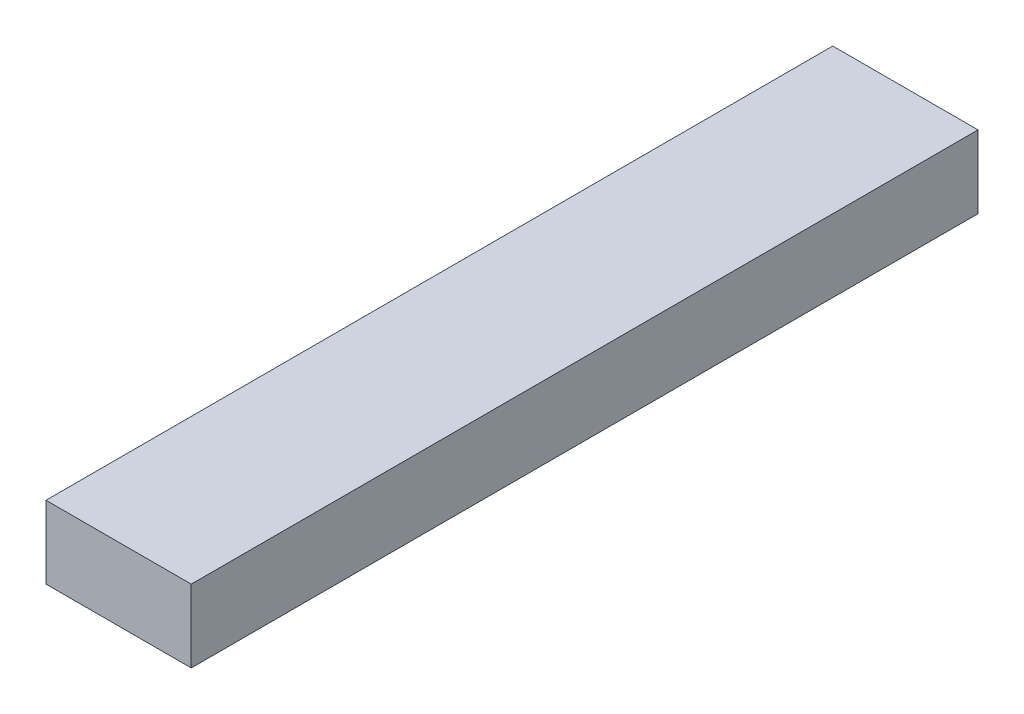
ISO-10303-21;
HEADER;
FILE_DESCRIPTION(('STEP AP214'),'2;1');
FILE_NAME('part.step','',(''),(''),'','','');
FILE_SCHEMA(('AUTOMOTIVE_DESIGN { 1 0 10303 214 1 1 1 1 }'));
ENDSEC;
DATA;
#1=APPLICATION_CONTEXT('core data for automotive mechanical design processes');
#2=APPLICATION_PROTOCOL_DEFINITION('international standard','automotive_design',2000,#1);
#3=PRODUCT_CONTEXT('',#1,'mechanical');
#4=PRODUCT('Part','Part','',(#3));
#5=PRODUCT_RELATED_PRODUCT_CATEGORY('part','',(#4));
#6=PRODUCT_DEFINITION_FORMATION('','',#4);
#7=PRODUCT_DEFINITION_CONTEXT('part definition',#1,'design');
#8=PRODUCT_DEFINITION('design','',#6,#7);
#9=PRODUCT_DEFINITION_SHAPE('','',#8);
#10=(LENGTH_UNIT() NAMED_UNIT(*) SI_UNIT(.MILLI.,.METRE.));
#11=(NAMED_UNIT(*) PLANE_ANGLE_UNIT() SI_UNIT($,.RADIAN.));
#12=(NAMED_UNIT(*) SI_UNIT($,.STERADIAN.) SOLID_ANGLE_UNIT());
#13=UNCERTAINTY_MEASURE_WITH_UNIT(LENGTH_MEASURE(1.E-05),#10,'distance_accuracy_value','');
#14=(GEOMETRIC_REPRESENTATION_CONTEXT(3) GLOBAL_UNCERTAINTY_ASSIGNED_CONTEXT((#13)) GLOBAL_UNIT_ASSIGNED_CONTEXT((#10,
#11,#12)) REPRESENTATION_CONTEXT('',''));
#15=CARTESIAN_POINT('',(0.,0.,0.));
#16=DIRECTION('',(0.,0.,1.));
#17=DIRECTION('',(1.,0.,0.));
#18=AXIS2_PLACEMENT_3D('',#15,#16,#17);
#19=CARTESIAN_POINT('',(23.9999999999999,23.9999999999989,129.999999999995));
#20=DIRECTION('',(-0.999999999999957,0.,0.));
#21=DIRECTION('',(0.,0.,0.999999999999957));
#22=AXIS2_PLACEMENT_3D('',#19,#20,#21);
#23=PLANE('',#22);
#24=DIRECTION('',(0.,0.,-0.999999999999957));
#25=VECTOR('',#24,1.);
#26=CARTESIAN_POINT('',(23.9999999999999,-1.0547118733939E-12,129.999999999995));
#27=LINE('',#26,#25);
#28=CARTESIAN_POINT('',(23.9999999999999,-1.0547118733939E-12,129.999999999995));
#29=VERTEX_POINT('',#28);
#30=CARTESIAN_POINT('',(23.9999999999997,-1.13797860024079E-12,-129.999999999995));
#31=VERTEX_POINT('',#30);
#32=EDGE_CURVE('E114',#29,#31,#27,.T.);
#33=ORIENTED_EDGE('',*,*,#32,.T.);
#34=DIRECTION('',(0.,-1.00000000000001,0.));
#35=VECTOR('',#34,1.);
#36=CARTESIAN_POINT('',(23.9999999999997,23.9999999999986,-129.999999999995));
#37=LINE('',#36,#35);
#38=CARTESIAN_POINT('',(23.9999999999997,23.9999999999986,-129.999999999995));
#39=VERTEX_POINT('',#38);
#40=EDGE_CURVE('E11',#39,#31,#37,.T.);
#41=ORIENTED_EDGE('',*,*,#40,.F.);
#42=DIRECTION('',(0.,0.,-0.999999999999957));
#43=VECTOR('',#42,1.);
#44=CARTESIAN_POINT('',(23.9999999999999,23.9999999999989,129.999999999995));
#45=LINE('',#44,#43);
#46=CARTESIAN_POINT('',(23.9999999999999,23.9999999999989,129.999999999995));
#47=VERTEX_POINT('',#46);
#48=EDGE_CURVE('E97',#47,#39,#45,.T.);
#49=ORIENTED_EDGE('',*,*,#48,.F.);
#50=DIRECTION('',(0.,-1.00000000000001,0.));
#51=VECTOR('',#50,1.);
#52=CARTESIAN_POINT('',(23.9999999999999,23.9999999999989,129.999999999995));
#53=LINE('',#52,#51);
#54=EDGE_CURVE('E110',#47,#29,#53,.T.);
#55=ORIENTED_EDGE('',*,*,#54,.T.);
#56=EDGE_LOOP('',(#33,#41,#49,#55));
#57=FACE_BOUND('',#56,.T.);
#58=ADVANCED_FACE('F45',(#57),#23,.F.);
#59=CARTESIAN_POINT('',(-23.9999999999976,23.9999999999986,-129.999999999995));
#60=DIRECTION('',(0.,0.,0.999999999999957));
#61=DIRECTION('',(0.999999999999957,0.,0.));
#62=AXIS2_PLACEMENT_3D('',#59,#60,#61);
#63=PLANE('',#62);
#64=DIRECTION('',(-0.999999999999957,0.,0.));
#65=VECTOR('',#64,1.);
#66=CARTESIAN_POINT('',(-23.9999999999976,-1.13797860024079E-12,-129.999999999995));
#67=LINE('',#66,#65);
#68=CARTESIAN_POINT('',(-23.9999999999976,-1.13797860024079E-12,-129.999999999995));
#69=VERTEX_POINT('',#68);
#70=EDGE_CURVE('E102',#31,#69,#67,.T.);
#71=ORIENTED_EDGE('',*,*,#70,.T.);
#72=DIRECTION('',(0.,-1.00000000000001,0.));
#73=VECTOR('',#72,1.);
#74=CARTESIAN_POINT('',(-23.9999999999976,23.9999999999986,-129.999999999995));
#75=LINE('',#74,#73);
#76=CARTESIAN_POINT('',(-23.9999999999976,23.9999999999986,-129.999999999995));
#77=VERTEX_POINT('',#76);
#78=EDGE_CURVE('E54',#77,#69,#75,.T.);
#79=ORIENTED_EDGE('',*,*,#78,.F.);
#80=DIRECTION('',(-0.999999999999957,0.,0.));
#81=VECTOR('',#80,1.);
#82=CARTESIAN_POINT('',(-23.9999999999976,23.9999999999986,-129.999999999995));
#83=LINE('',#82,#81);
#84=EDGE_CURVE('E92',#39,#77,#83,.T.);
#85=ORIENTED_EDGE('',*,*,#84,.F.);
#86=ORIENTED_EDGE('',*,*,#40,.T.);
#87=EDGE_LOOP('',(#71,#79,#85,#86));
#88=FACE_BOUND('',#87,.T.);
#89=ADVANCED_FACE('F101',(#88),#63,.F.);
#90=CARTESIAN_POINT('',(-23.9999999999973,23.9999999999989,129.999999999995));
#91=DIRECTION('',(0.999999999999957,0.,0.));
#92=DIRECTION('',(0.,0.,-0.999999999999957));
#93=AXIS2_PLACEMENT_3D('',#90,#91,#92);
#94=PLANE('',#93);
#95=DIRECTION('',(0.,0.,0.999999999999957));
#96=VECTOR('',#95,1.);
#97=CARTESIAN_POINT('',(-23.9999999999973,-1.0547118733939E-12,129.999999999995));
#98=LINE('',#97,#96);
#99=CARTESIAN_POINT('',(-23.9999999999973,-1.0547118733939E-12,129.999999999995));
#100=VERTEX_POINT('',#99);
#101=EDGE_CURVE('E79',#69,#100,#98,.T.);
#102=ORIENTED_EDGE('',*,*,#101,.T.);
#103=DIRECTION('',(0.,-1.00000000000001,0.));
#104=VECTOR('',#103,1.);
#105=CARTESIAN_POINT('',(-23.9999999999973,23.9999999999989,129.999999999995));
#106=LINE('',#105,#104);
#107=CARTESIAN_POINT('',(-23.9999999999973,23.9999999999989,129.999999999995));
#108=VERTEX_POINT('',#107);
#109=EDGE_CURVE('E104',#108,#100,#106,.T.);
#110=ORIENTED_EDGE('',*,*,#109,.F.);
#111=DIRECTION('',(0.,0.,0.999999999999957));
#112=VECTOR('',#111,1.);
#113=CARTESIAN_POINT('',(-23.9999999999973,23.9999999999989,129.999999999995));
#114=LINE('',#113,#112);
#115=EDGE_CURVE('E95',#77,#108,#114,.T.);
#116=ORIENTED_EDGE('',*,*,#115,.F.);
#117=ORIENTED_EDGE('',*,*,#78,.T.);
#118=EDGE_LOOP('',(#102,#110,#116,#117));
#119=FACE_BOUND('',#118,.T.);
#120=ADVANCED_FACE('F105',(#119),#94,.F.);
#121=CARTESIAN_POINT('',(-23.9999999999973,23.9999999999989,129.999999999995));
#122=DIRECTION('',(0.,0.,-0.999999999999957));
#123=DIRECTION('',(-0.999999999999957,0.,0.));
#124=AXIS2_PLACEMENT_3D('',#121,#122,#123);
#125=PLANE('',#124);
#126=DIRECTION('',(0.999999999999957,0.,0.));
#127=VECTOR('',#126,1.);
#128=CARTESIAN_POINT('',(-23.9999999999973,-1.0547118733939E-12,129.999999999995));
#129=LINE('',#128,#127);
#130=EDGE_CURVE('E85',#100,#29,#129,.T.);
#131=ORIENTED_EDGE('',*,*,#130,.T.);
#132=ORIENTED_EDGE('',*,*,#54,.F.);
#133=DIRECTION('',(0.999999999999957,0.,0.));
#134=VECTOR('',#133,1.);
#135=CARTESIAN_POINT('',(-23.9999999999973,23.9999999999989,129.999999999995));
#136=LINE('',#135,#134);
#137=EDGE_CURVE('E62',#108,#47,#136,.T.);
#138=ORIENTED_EDGE('',*,*,#137,.F.);
#139=ORIENTED_EDGE('',*,*,#109,.T.);
#140=EDGE_LOOP('',(#131,#132,#138,#139));
#141=FACE_BOUND('',#140,.T.);
#142=ADVANCED_FACE('F128',(#141),#125,.F.);
#143=CARTESIAN_POINT('',(0.,24.0000000000002,0.));
#144=DIRECTION('',(0.,-1.00000000000001,0.));
#145=DIRECTION('',(0.,0.,-0.999999999999957));
#146=AXIS2_PLACEMENT_3D('',#143,#144,#145);
#147=PLANE('',#146);
#148=ORIENTED_EDGE('',*,*,#48,.T.);
#149=ORIENTED_EDGE('',*,*,#84,.T.);
#150=ORIENTED_EDGE('',*,*,#115,.T.);
#151=ORIENTED_EDGE('',*,*,#137,.T.);
#152=EDGE_LOOP('',(#148,#149,#150,#151));
#153=FACE_BOUND('',#152,.T.);
#154=ADVANCED_FACE('F93',(#153),#147,.F.);
#155=CARTESIAN_POINT('',(0.,0.,0.));
#156=DIRECTION('',(0.,-1.00000000000001,0.));
#157=DIRECTION('',(0.,0.,-0.999999999999957));
#158=AXIS2_PLACEMENT_3D('',#155,#156,#157);
#159=PLANE('',#158);
#160=ORIENTED_EDGE('',*,*,#32,.F.);
#161=ORIENTED_EDGE('',*,*,#130,.F.);
#162=ORIENTED_EDGE('',*,*,#101,.F.);
#163=ORIENTED_EDGE('',*,*,#70,.F.);
#164=EDGE_LOOP('',(#160,#161,#162,#163));
#165=FACE_BOUND('',#164,.T.);
#166=ADVANCED_FACE('F131',(#165),#159,.T.);
#167=CLOSED_SHELL('',(#58,#89,#120,#142,#154,#166));
#168=MANIFOLD_SOLID_BREP('B2',#167);
#169=ADVANCED_BREP_SHAPE_REPRESENTATION('',(#18,#168),#14);
#170=SHAPE_DEFINITION_REPRESENTATION(#9,#169);
ENDSEC;
END-ISO-10303-21;
